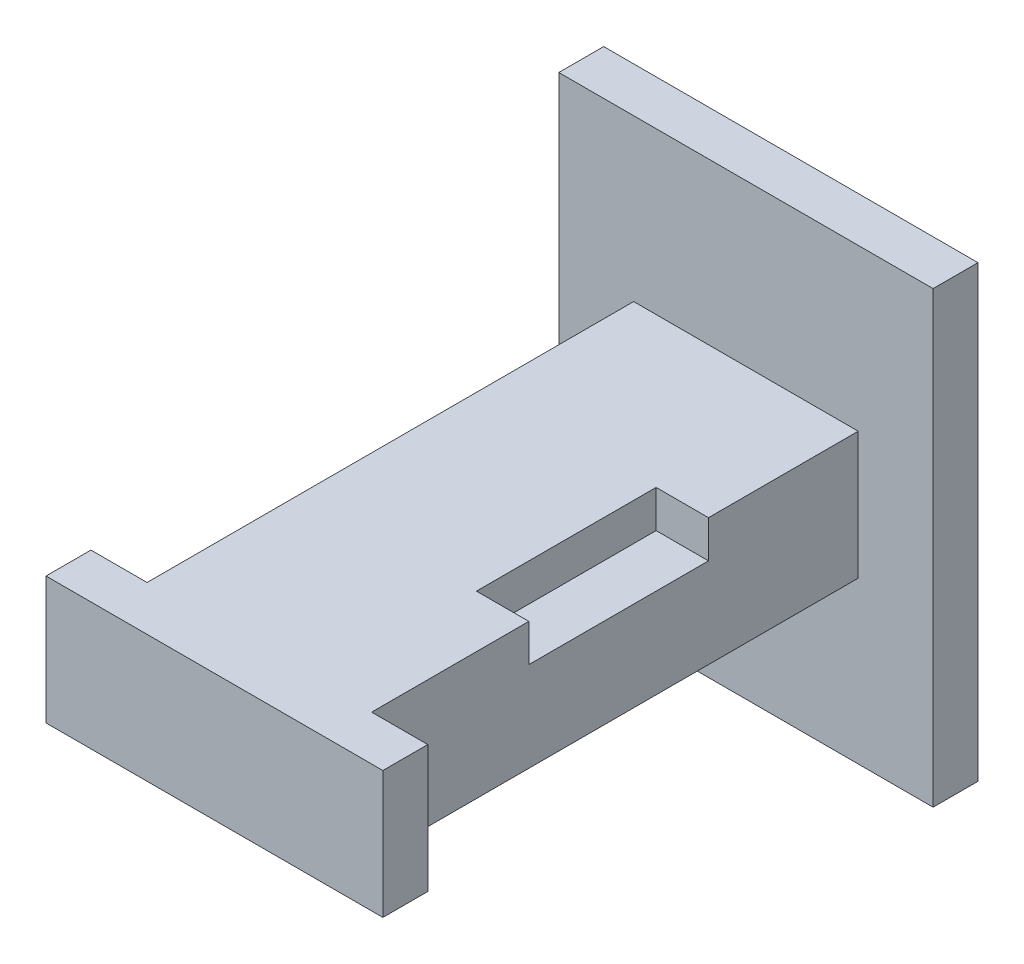
ISO-10303-21;
HEADER;
FILE_DESCRIPTION(('STEP AP214'),'2;1');
FILE_NAME('part.step','',(''),(''),'','','');
FILE_SCHEMA(('AUTOMOTIVE_DESIGN { 1 0 10303 214 1 1 1 1 }'));
ENDSEC;
DATA;
#1=APPLICATION_CONTEXT('core data for automotive mechanical design processes');
#2=APPLICATION_PROTOCOL_DEFINITION('international standard','automotive_design',2000,#1);
#3=PRODUCT_CONTEXT('',#1,'mechanical');
#4=PRODUCT('Part','Part','',(#3));
#5=PRODUCT_RELATED_PRODUCT_CATEGORY('part','',(#4));
#6=PRODUCT_DEFINITION_FORMATION('','',#4);
#7=PRODUCT_DEFINITION_CONTEXT('part definition',#1,'design');
#8=PRODUCT_DEFINITION('design','',#6,#7);
#9=PRODUCT_DEFINITION_SHAPE('','',#8);
#10=(LENGTH_UNIT() NAMED_UNIT(*) SI_UNIT(.MILLI.,.METRE.));
#11=(NAMED_UNIT(*) PLANE_ANGLE_UNIT() SI_UNIT($,.RADIAN.));
#12=(NAMED_UNIT(*) SI_UNIT($,.STERADIAN.) SOLID_ANGLE_UNIT());
#13=UNCERTAINTY_MEASURE_WITH_UNIT(LENGTH_MEASURE(1.E-05),#10,'distance_accuracy_value','');
#14=(GEOMETRIC_REPRESENTATION_CONTEXT(3) GLOBAL_UNCERTAINTY_ASSIGNED_CONTEXT((#13)) GLOBAL_UNIT_ASSIGNED_CONTEXT((#10,
#11,#12)) REPRESENTATION_CONTEXT('',''));
#15=CARTESIAN_POINT('',(0.,0.,0.));
#16=DIRECTION('',(0.,0.,1.));
#17=DIRECTION('',(1.,0.,0.));
#18=AXIS2_PLACEMENT_3D('',#15,#16,#17);
#19=CARTESIAN_POINT('',(0.,0.,71.));
#20=DIRECTION('',(0.,0.,-1.));
#21=DIRECTION('',(-1.,0.,0.));
#22=AXIS2_PLACEMENT_3D('',#19,#20,#21);
#23=PLANE('',#22);
#24=DIRECTION('',(1.,0.,0.));
#25=VECTOR('',#24,1.);
#26=CARTESIAN_POINT('',(-22.5,-8.5,71.));
#27=LINE('',#26,#25);
#28=CARTESIAN_POINT('',(-22.5,-8.5,71.));
#29=VERTEX_POINT('',#28);
#30=CARTESIAN_POINT('',(-15.,-8.5,71.));
#31=VERTEX_POINT('',#30);
#32=EDGE_CURVE('E180',#29,#31,#27,.T.);
#33=ORIENTED_EDGE('',*,*,#32,.F.);
#34=DIRECTION('',(0.,-1.,0.));
#35=VECTOR('',#34,1.);
#36=CARTESIAN_POINT('',(-22.5,-15.,71.));
#37=LINE('',#36,#35);
#38=CARTESIAN_POINT('',(-22.5,8.5,71.));
#39=VERTEX_POINT('',#38);
#40=EDGE_CURVE('E194',#39,#29,#37,.T.);
#41=ORIENTED_EDGE('',*,*,#40,.F.);
#42=DIRECTION('',(-1.,0.,0.));
#43=VECTOR('',#42,1.);
#44=CARTESIAN_POINT('',(22.5,8.5,71.));
#45=LINE('',#44,#43);
#46=CARTESIAN_POINT('',(-15.,8.5,71.));
#47=VERTEX_POINT('',#46);
#48=EDGE_CURVE('E556',#47,#39,#45,.T.);
#49=ORIENTED_EDGE('',*,*,#48,.F.);
#50=DIRECTION('',(0.,-1.,0.));
#51=VECTOR('',#50,1.);
#52=CARTESIAN_POINT('',(-15.,-8.5,71.));
#53=LINE('',#52,#51);
#54=EDGE_CURVE('E207',#47,#31,#53,.T.);
#55=ORIENTED_EDGE('',*,*,#54,.T.);
#56=EDGE_LOOP('',(#33,#41,#49,#55));
#57=FACE_BOUND('',#56,.T.);
#58=ADVANCED_FACE('F34',(#57),#23,.T.);
#59=CARTESIAN_POINT('',(0.,0.,6.));
#60=DIRECTION('',(0.,0.,-1.));
#61=DIRECTION('',(-1.,0.,0.));
#62=AXIS2_PLACEMENT_3D('',#59,#60,#61);
#63=PLANE('',#62);
#64=DIRECTION('',(0.,1.,0.));
#65=VECTOR('',#64,1.);
#66=CARTESIAN_POINT('',(25.,-30.,6.));
#67=LINE('',#66,#65);
#68=CARTESIAN_POINT('',(25.,-30.,6.));
#69=VERTEX_POINT('',#68);
#70=CARTESIAN_POINT('',(25.,30.,6.));
#71=VERTEX_POINT('',#70);
#72=EDGE_CURVE('E234',#69,#71,#67,.T.);
#73=ORIENTED_EDGE('',*,*,#72,.T.);
#74=DIRECTION('',(-1.,0.,0.));
#75=VECTOR('',#74,1.);
#76=CARTESIAN_POINT('',(-25.,30.,6.));
#77=LINE('',#76,#75);
#78=CARTESIAN_POINT('',(-25.,30.,6.));
#79=VERTEX_POINT('',#78);
#80=EDGE_CURVE('E237',#71,#79,#77,.T.);
#81=ORIENTED_EDGE('',*,*,#80,.T.);
#82=DIRECTION('',(0.,-1.,0.));
#83=VECTOR('',#82,1.);
#84=CARTESIAN_POINT('',(-25.,-30.,6.));
#85=LINE('',#84,#83);
#86=CARTESIAN_POINT('',(-25.,-30.,6.));
#87=VERTEX_POINT('',#86);
#88=EDGE_CURVE('E240',#79,#87,#85,.T.);
#89=ORIENTED_EDGE('',*,*,#88,.T.);
#90=DIRECTION('',(1.,0.,0.));
#91=VECTOR('',#90,1.);
#92=CARTESIAN_POINT('',(-25.,-30.,6.));
#93=LINE('',#92,#91);
#94=EDGE_CURVE('E242',#87,#69,#93,.T.);
#95=ORIENTED_EDGE('',*,*,#94,.T.);
#96=EDGE_LOOP('',(#73,#81,#89,#95));
#97=FACE_BOUND('',#96,.T.);
#98=DIRECTION('',(0.,1.,0.));
#99=VECTOR('',#98,1.);
#100=CARTESIAN_POINT('',(15.,-8.5,6.));
#101=LINE('',#100,#99);
#102=CARTESIAN_POINT('',(15.,-8.5,6.));
#103=VERTEX_POINT('',#102);
#104=CARTESIAN_POINT('',(15.,8.5,6.));
#105=VERTEX_POINT('',#104);
#106=EDGE_CURVE('E211',#103,#105,#101,.T.);
#107=ORIENTED_EDGE('',*,*,#106,.F.);
#108=DIRECTION('',(1.,0.,0.));
#109=VECTOR('',#108,1.);
#110=CARTESIAN_POINT('',(-15.,-8.5,6.));
#111=LINE('',#110,#109);
#112=CARTESIAN_POINT('',(-15.,-8.5,6.));
#113=VERTEX_POINT('',#112);
#114=EDGE_CURVE('E208',#113,#103,#111,.T.);
#115=ORIENTED_EDGE('',*,*,#114,.F.);
#116=DIRECTION('',(0.,-1.,0.));
#117=VECTOR('',#116,1.);
#118=CARTESIAN_POINT('',(-15.,-8.5,6.));
#119=LINE('',#118,#117);
#120=CARTESIAN_POINT('',(-15.,8.5,6.));
#121=VERTEX_POINT('',#120);
#122=EDGE_CURVE('E217',#121,#113,#119,.T.);
#123=ORIENTED_EDGE('',*,*,#122,.F.);
#124=DIRECTION('',(-1.,0.,0.));
#125=VECTOR('',#124,1.);
#126=CARTESIAN_POINT('',(-15.,8.5,6.));
#127=LINE('',#126,#125);
#128=EDGE_CURVE('E214',#105,#121,#127,.T.);
#129=ORIENTED_EDGE('',*,*,#128,.F.);
#130=EDGE_LOOP('',(#107,#115,#123,#129));
#131=FACE_BOUND('',#130,.T.);
#132=ADVANCED_FACE('F276',(#97,#131),#63,.F.);
#133=CARTESIAN_POINT('',(25.,-30.,6.));
#134=DIRECTION('',(-1.,0.,0.));
#135=DIRECTION('',(0.,0.,1.));
#136=AXIS2_PLACEMENT_3D('',#133,#134,#135);
#137=PLANE('',#136);
#138=DIRECTION('',(0.,1.,0.));
#139=VECTOR('',#138,1.);
#140=CARTESIAN_POINT('',(25.,-30.,0.));
#141=LINE('',#140,#139);
#142=CARTESIAN_POINT('',(25.,-30.,0.));
#143=VERTEX_POINT('',#142);
#144=CARTESIAN_POINT('',(25.,30.,0.));
#145=VERTEX_POINT('',#144);
#146=EDGE_CURVE('E233',#143,#145,#141,.T.);
#147=ORIENTED_EDGE('',*,*,#146,.T.);
#148=DIRECTION('',(0.,0.,-1.));
#149=VECTOR('',#148,1.);
#150=CARTESIAN_POINT('',(25.,30.,6.));
#151=LINE('',#150,#149);
#152=EDGE_CURVE('E11',#71,#145,#151,.T.);
#153=ORIENTED_EDGE('',*,*,#152,.F.);
#154=ORIENTED_EDGE('',*,*,#72,.F.);
#155=DIRECTION('',(0.,0.,-1.));
#156=VECTOR('',#155,1.);
#157=CARTESIAN_POINT('',(25.,-30.,6.));
#158=LINE('',#157,#156);
#159=EDGE_CURVE('E244',#69,#143,#158,.T.);
#160=ORIENTED_EDGE('',*,*,#159,.T.);
#161=EDGE_LOOP('',(#147,#153,#154,#160));
#162=FACE_BOUND('',#161,.T.);
#163=ADVANCED_FACE('F36',(#162),#137,.F.);
#164=CARTESIAN_POINT('',(-25.,30.,6.));
#165=DIRECTION('',(0.,-1.,0.));
#166=DIRECTION('',(0.,0.,-1.));
#167=AXIS2_PLACEMENT_3D('',#164,#165,#166);
#168=PLANE('',#167);
#169=DIRECTION('',(-1.,0.,0.));
#170=VECTOR('',#169,1.);
#171=CARTESIAN_POINT('',(-25.,30.,0.));
#172=LINE('',#171,#170);
#173=CARTESIAN_POINT('',(-25.,30.,0.));
#174=VERTEX_POINT('',#173);
#175=EDGE_CURVE('E247',#145,#174,#172,.T.);
#176=ORIENTED_EDGE('',*,*,#175,.T.);
#177=DIRECTION('',(0.,0.,-1.));
#178=VECTOR('',#177,1.);
#179=CARTESIAN_POINT('',(-25.,30.,6.));
#180=LINE('',#179,#178);
#181=EDGE_CURVE('E42',#79,#174,#180,.T.);
#182=ORIENTED_EDGE('',*,*,#181,.F.);
#183=ORIENTED_EDGE('',*,*,#80,.F.);
#184=ORIENTED_EDGE('',*,*,#152,.T.);
#185=EDGE_LOOP('',(#176,#182,#183,#184));
#186=FACE_BOUND('',#185,.T.);
#187=ADVANCED_FACE('F278',(#186),#168,.F.);
#188=CARTESIAN_POINT('',(-25.,-30.,6.));
#189=DIRECTION('',(1.,0.,0.));
#190=DIRECTION('',(0.,0.,-1.));
#191=AXIS2_PLACEMENT_3D('',#188,#189,#190);
#192=PLANE('',#191);
#193=DIRECTION('',(0.,-1.,0.));
#194=VECTOR('',#193,1.);
#195=CARTESIAN_POINT('',(-25.,-30.,0.));
#196=LINE('',#195,#194);
#197=CARTESIAN_POINT('',(-25.,-30.,0.));
#198=VERTEX_POINT('',#197);
#199=EDGE_CURVE('E249',#174,#198,#196,.T.);
#200=ORIENTED_EDGE('',*,*,#199,.T.);
#201=DIRECTION('',(0.,0.,-1.));
#202=VECTOR('',#201,1.);
#203=CARTESIAN_POINT('',(-25.,-30.,6.));
#204=LINE('',#203,#202);
#205=EDGE_CURVE('E254',#87,#198,#204,.T.);
#206=ORIENTED_EDGE('',*,*,#205,.F.);
#207=ORIENTED_EDGE('',*,*,#88,.F.);
#208=ORIENTED_EDGE('',*,*,#181,.T.);
#209=EDGE_LOOP('',(#200,#206,#207,#208));
#210=FACE_BOUND('',#209,.T.);
#211=ADVANCED_FACE('F261',(#210),#192,.F.);
#212=CARTESIAN_POINT('',(-25.,-30.,6.));
#213=DIRECTION('',(0.,1.,0.));
#214=DIRECTION('',(0.,0.,1.));
#215=AXIS2_PLACEMENT_3D('',#212,#213,#214);
#216=PLANE('',#215);
#217=DIRECTION('',(1.,0.,0.));
#218=VECTOR('',#217,1.);
#219=CARTESIAN_POINT('',(-25.,-30.,0.));
#220=LINE('',#219,#218);
#221=EDGE_CURVE('E238',#198,#143,#220,.T.);
#222=ORIENTED_EDGE('',*,*,#221,.T.);
#223=ORIENTED_EDGE('',*,*,#159,.F.);
#224=ORIENTED_EDGE('',*,*,#94,.F.);
#225=ORIENTED_EDGE('',*,*,#205,.T.);
#226=EDGE_LOOP('',(#222,#223,#224,#225));
#227=FACE_BOUND('',#226,.T.);
#228=ADVANCED_FACE('F270',(#227),#216,.F.);
#229=CARTESIAN_POINT('',(0.,0.,0.));
#230=DIRECTION('',(0.,0.,-1.));
#231=DIRECTION('',(-1.,0.,0.));
#232=AXIS2_PLACEMENT_3D('',#229,#230,#231);
#233=PLANE('',#232);
#234=ORIENTED_EDGE('',*,*,#146,.F.);
#235=ORIENTED_EDGE('',*,*,#221,.F.);
#236=ORIENTED_EDGE('',*,*,#199,.F.);
#237=ORIENTED_EDGE('',*,*,#175,.F.);
#238=EDGE_LOOP('',(#234,#235,#236,#237));
#239=FACE_BOUND('',#238,.T.);
#240=ADVANCED_FACE('F267',(#239),#233,.T.);
#241=CARTESIAN_POINT('',(15.,-8.5,71.));
#242=DIRECTION('',(-1.,0.,0.));
#243=DIRECTION('',(0.,0.,1.));
#244=AXIS2_PLACEMENT_3D('',#241,#242,#243);
#245=PLANE('',#244);
#246=DIRECTION('',(0.,0.,-1.));
#247=VECTOR('',#246,1.);
#248=CARTESIAN_POINT('',(15.,3.5,50.));
#249=LINE('',#248,#247);
#250=CARTESIAN_POINT('',(15.,3.5,50.));
#251=VERTEX_POINT('',#250);
#252=CARTESIAN_POINT('',(15.,3.5,26.));
#253=VERTEX_POINT('',#252);
#254=EDGE_CURVE('E504',#251,#253,#249,.T.);
#255=ORIENTED_EDGE('',*,*,#254,.F.);
#256=DIRECTION('',(0.,-1.,0.));
#257=VECTOR('',#256,1.);
#258=CARTESIAN_POINT('',(15.,8.5,50.));
#259=LINE('',#258,#257);
#260=CARTESIAN_POINT('',(15.,8.5,50.));
#261=VERTEX_POINT('',#260);
#262=EDGE_CURVE('E512',#261,#251,#259,.T.);
#263=ORIENTED_EDGE('',*,*,#262,.F.);
#264=DIRECTION('',(0.,0.,-1.));
#265=VECTOR('',#264,1.);
#266=CARTESIAN_POINT('',(15.,8.5,71.));
#267=LINE('',#266,#265);
#268=CARTESIAN_POINT('',(15.,8.5,71.));
#269=VERTEX_POINT('',#268);
#270=EDGE_CURVE('E230',#269,#261,#267,.T.);
#271=ORIENTED_EDGE('',*,*,#270,.F.);
#272=DIRECTION('',(0.,1.,0.));
#273=VECTOR('',#272,1.);
#274=CARTESIAN_POINT('',(15.,-8.5,71.));
#275=LINE('',#274,#273);
#276=CARTESIAN_POINT('',(15.,-8.5,71.));
#277=VERTEX_POINT('',#276);
#278=EDGE_CURVE('E205',#277,#269,#275,.T.);
#279=ORIENTED_EDGE('',*,*,#278,.F.);
#280=DIRECTION('',(0.,0.,-1.));
#281=VECTOR('',#280,1.);
#282=CARTESIAN_POINT('',(15.,-8.5,71.));
#283=LINE('',#282,#281);
#284=EDGE_CURVE('E175',#277,#103,#283,.T.);
#285=ORIENTED_EDGE('',*,*,#284,.T.);
#286=ORIENTED_EDGE('',*,*,#106,.T.);
#287=CARTESIAN_POINT('',(15.,8.5,26.));
#288=VERTEX_POINT('',#287);
#289=EDGE_CURVE('E229',#288,#105,#267,.T.);
#290=ORIENTED_EDGE('',*,*,#289,.F.);
#291=DIRECTION('',(0.,1.,0.));
#292=VECTOR('',#291,1.);
#293=CARTESIAN_POINT('',(15.,8.5,26.));
#294=LINE('',#293,#292);
#295=EDGE_CURVE('E500',#253,#288,#294,.T.);
#296=ORIENTED_EDGE('',*,*,#295,.F.);
#297=EDGE_LOOP('',(#255,#263,#271,#279,#285,#286,#290,#296));
#298=FACE_BOUND('',#297,.T.);
#299=ADVANCED_FACE('F313',(#298),#245,.F.);
#300=CARTESIAN_POINT('',(-15.,8.5,71.));
#301=DIRECTION('',(0.,-1.,0.));
#302=DIRECTION('',(0.,0.,-1.));
#303=AXIS2_PLACEMENT_3D('',#300,#301,#302);
#304=PLANE('',#303);
#305=ORIENTED_EDGE('',*,*,#270,.T.);
#306=DIRECTION('',(1.,0.,0.));
#307=VECTOR('',#306,1.);
#308=CARTESIAN_POINT('',(8.,8.5,50.));
#309=LINE('',#308,#307);
#310=CARTESIAN_POINT('',(8.,8.5,50.));
#311=VERTEX_POINT('',#310);
#312=EDGE_CURVE('E518',#311,#261,#309,.T.);
#313=ORIENTED_EDGE('',*,*,#312,.F.);
#314=DIRECTION('',(0.,0.,1.));
#315=VECTOR('',#314,1.);
#316=CARTESIAN_POINT('',(8.,8.5,50.));
#317=LINE('',#316,#315);
#318=CARTESIAN_POINT('',(8.,8.5,26.));
#319=VERTEX_POINT('',#318);
#320=EDGE_CURVE('E498',#319,#311,#317,.T.);
#321=ORIENTED_EDGE('',*,*,#320,.F.);
#322=DIRECTION('',(1.,0.,0.));
#323=VECTOR('',#322,1.);
#324=CARTESIAN_POINT('',(8.,8.5,26.));
#325=LINE('',#324,#323);
#326=EDGE_CURVE('E521',#319,#288,#325,.T.);
#327=ORIENTED_EDGE('',*,*,#326,.T.);
#328=ORIENTED_EDGE('',*,*,#289,.T.);
#329=ORIENTED_EDGE('',*,*,#128,.T.);
#330=DIRECTION('',(0.,0.,-1.));
#331=VECTOR('',#330,1.);
#332=CARTESIAN_POINT('',(-15.,8.5,71.));
#333=LINE('',#332,#331);
#334=EDGE_CURVE('E226',#47,#121,#333,.T.);
#335=ORIENTED_EDGE('',*,*,#334,.F.);
#336=ORIENTED_EDGE('',*,*,#48,.T.);
#337=DIRECTION('',(0.,0.,1.));
#338=VECTOR('',#337,1.);
#339=CARTESIAN_POINT('',(-22.5,8.5,71.));
#340=LINE('',#339,#338);
#341=CARTESIAN_POINT('',(-22.5,8.5,77.));
#342=VERTEX_POINT('',#341);
#343=EDGE_CURVE('E57',#39,#342,#340,.T.);
#344=ORIENTED_EDGE('',*,*,#343,.T.);
#345=DIRECTION('',(1.,0.,0.));
#346=VECTOR('',#345,1.);
#347=CARTESIAN_POINT('',(-22.5,8.5,77.));
#348=LINE('',#347,#346);
#349=CARTESIAN_POINT('',(22.5,8.5,77.));
#350=VERTEX_POINT('',#349);
#351=EDGE_CURVE('E552',#342,#350,#348,.T.);
#352=ORIENTED_EDGE('',*,*,#351,.T.);
#353=DIRECTION('',(0.,0.,-1.));
#354=VECTOR('',#353,1.);
#355=CARTESIAN_POINT('',(22.5,8.5,77.));
#356=LINE('',#355,#354);
#357=CARTESIAN_POINT('',(22.5,8.5,71.));
#358=VERTEX_POINT('',#357);
#359=EDGE_CURVE('E515',#350,#358,#356,.T.);
#360=ORIENTED_EDGE('',*,*,#359,.T.);
#361=EDGE_CURVE('E193',#358,#269,#45,.T.);
#362=ORIENTED_EDGE('',*,*,#361,.T.);
#363=EDGE_LOOP('',(#305,#313,#321,#327,#328,#329,#335,#336,#344,#352,#360,#362));
#364=FACE_BOUND('',#363,.T.);
#365=ADVANCED_FACE('F307',(#364),#304,.F.);
#366=CARTESIAN_POINT('',(-15.,-8.5,71.));
#367=DIRECTION('',(1.,0.,0.));
#368=DIRECTION('',(0.,0.,-1.));
#369=AXIS2_PLACEMENT_3D('',#366,#367,#368);
#370=PLANE('',#369);
#371=DIRECTION('',(0.,0.,-1.));
#372=VECTOR('',#371,1.);
#373=CARTESIAN_POINT('',(-15.,-8.5,71.));
#374=LINE('',#373,#372);
#375=CARTESIAN_POINT('',(-15.,-8.5,33.));
#376=VERTEX_POINT('',#375);
#377=EDGE_CURVE('E222',#376,#113,#374,.T.);
#378=ORIENTED_EDGE('',*,*,#377,.F.);
#379=DIRECTION('',(0.,-1.,0.));
#380=VECTOR('',#379,1.);
#381=CARTESIAN_POINT('',(-15.,-8.5,33.));
#382=LINE('',#381,#380);
#383=CARTESIAN_POINT('',(-15.,4.5,33.));
#384=VERTEX_POINT('',#383);
#385=EDGE_CURVE('E520',#384,#376,#382,.T.);
#386=ORIENTED_EDGE('',*,*,#385,.F.);
#387=DIRECTION('',(0.,0.,-1.));
#388=VECTOR('',#387,1.);
#389=CARTESIAN_POINT('',(-15.,4.5,33.));
#390=LINE('',#389,#388);
#391=CARTESIAN_POINT('',(-15.,4.5,51.));
#392=VERTEX_POINT('',#391);
#393=EDGE_CURVE('E530',#392,#384,#390,.T.);
#394=ORIENTED_EDGE('',*,*,#393,.F.);
#395=DIRECTION('',(0.,1.,0.));
#396=VECTOR('',#395,1.);
#397=CARTESIAN_POINT('',(-15.,-8.5,51.));
#398=LINE('',#397,#396);
#399=CARTESIAN_POINT('',(-15.,-8.5,51.));
#400=VERTEX_POINT('',#399);
#401=EDGE_CURVE('E541',#400,#392,#398,.T.);
#402=ORIENTED_EDGE('',*,*,#401,.F.);
#403=EDGE_CURVE('E223',#31,#400,#374,.T.);
#404=ORIENTED_EDGE('',*,*,#403,.F.);
#405=ORIENTED_EDGE('',*,*,#54,.F.);
#406=ORIENTED_EDGE('',*,*,#334,.T.);
#407=ORIENTED_EDGE('',*,*,#122,.T.);
#408=EDGE_LOOP('',(#378,#386,#394,#402,#404,#405,#406,#407));
#409=FACE_BOUND('',#408,.T.);
#410=ADVANCED_FACE('F302',(#409),#370,.F.);
#411=CARTESIAN_POINT('',(-15.,-8.5,71.));
#412=DIRECTION('',(0.,1.,0.));
#413=DIRECTION('',(0.,0.,1.));
#414=AXIS2_PLACEMENT_3D('',#411,#412,#413);
#415=PLANE('',#414);
#416=DIRECTION('',(0.,0.,1.));
#417=VECTOR('',#416,1.);
#418=CARTESIAN_POINT('',(-5.,-8.5,33.));
#419=LINE('',#418,#417);
#420=CARTESIAN_POINT('',(-5.,-8.5,33.));
#421=VERTEX_POINT('',#420);
#422=CARTESIAN_POINT('',(-5.,-8.5,51.));
#423=VERTEX_POINT('',#422);
#424=EDGE_CURVE('E529',#421,#423,#419,.T.);
#425=ORIENTED_EDGE('',*,*,#424,.F.);
#426=DIRECTION('',(-1.,0.,0.));
#427=VECTOR('',#426,1.);
#428=CARTESIAN_POINT('',(-5.,-8.5,33.));
#429=LINE('',#428,#427);
#430=EDGE_CURVE('E539',#421,#376,#429,.T.);
#431=ORIENTED_EDGE('',*,*,#430,.T.);
#432=ORIENTED_EDGE('',*,*,#377,.T.);
#433=ORIENTED_EDGE('',*,*,#114,.T.);
#434=ORIENTED_EDGE('',*,*,#284,.F.);
#435=CARTESIAN_POINT('',(22.5,-8.5,71.));
#436=VERTEX_POINT('',#435);
#437=EDGE_CURVE('E170',#277,#436,#27,.T.);
#438=ORIENTED_EDGE('',*,*,#437,.T.);
#439=DIRECTION('',(0.,0.,1.));
#440=VECTOR('',#439,1.);
#441=CARTESIAN_POINT('',(22.5,-8.5,71.));
#442=LINE('',#441,#440);
#443=CARTESIAN_POINT('',(22.5,-8.5,77.));
#444=VERTEX_POINT('',#443);
#445=EDGE_CURVE('E49',#436,#444,#442,.T.);
#446=ORIENTED_EDGE('',*,*,#445,.T.);
#447=DIRECTION('',(-1.,0.,0.));
#448=VECTOR('',#447,1.);
#449=CARTESIAN_POINT('',(22.5,-8.5,77.));
#450=LINE('',#449,#448);
#451=CARTESIAN_POINT('',(-22.5,-8.5,77.));
#452=VERTEX_POINT('',#451);
#453=EDGE_CURVE('E189',#444,#452,#450,.T.);
#454=ORIENTED_EDGE('',*,*,#453,.T.);
#455=DIRECTION('',(0.,0.,-1.));
#456=VECTOR('',#455,1.);
#457=CARTESIAN_POINT('',(-22.5,-8.5,77.));
#458=LINE('',#457,#456);
#459=EDGE_CURVE('E555',#452,#29,#458,.T.);
#460=ORIENTED_EDGE('',*,*,#459,.T.);
#461=ORIENTED_EDGE('',*,*,#32,.T.);
#462=ORIENTED_EDGE('',*,*,#403,.T.);
#463=DIRECTION('',(-1.,0.,0.));
#464=VECTOR('',#463,1.);
#465=CARTESIAN_POINT('',(-5.,-8.5,51.));
#466=LINE('',#465,#464);
#467=EDGE_CURVE('E547',#423,#400,#466,.T.);
#468=ORIENTED_EDGE('',*,*,#467,.F.);
#469=EDGE_LOOP('',(#425,#431,#432,#433,#434,#438,#446,#454,#460,#461,#462,#468));
#470=FACE_BOUND('',#469,.T.);
#471=ADVANCED_FACE('F172',(#470),#415,.F.);
#472=ORIENTED_EDGE('',*,*,#437,.F.);
#473=ORIENTED_EDGE('',*,*,#278,.T.);
#474=ORIENTED_EDGE('',*,*,#361,.F.);
#475=DIRECTION('',(0.,1.,0.));
#476=VECTOR('',#475,1.);
#477=CARTESIAN_POINT('',(22.5,-15.,71.));
#478=LINE('',#477,#476);
#479=EDGE_CURVE('E186',#436,#358,#478,.T.);
#480=ORIENTED_EDGE('',*,*,#479,.F.);
#481=EDGE_LOOP('',(#472,#473,#474,#480));
#482=FACE_BOUND('',#481,.T.);
#483=ADVANCED_FACE('F192',(#482),#23,.T.);
#484=CARTESIAN_POINT('',(22.5,-15.,77.));
#485=DIRECTION('',(-1.,0.,0.));
#486=DIRECTION('',(0.,0.,1.));
#487=AXIS2_PLACEMENT_3D('',#484,#485,#486);
#488=PLANE('',#487);
#489=DIRECTION('',(0.,1.,0.));
#490=VECTOR('',#489,1.);
#491=CARTESIAN_POINT('',(22.5,-15.,77.));
#492=LINE('',#491,#490);
#493=EDGE_CURVE('E188',#444,#350,#492,.T.);
#494=ORIENTED_EDGE('',*,*,#493,.F.);
#495=ORIENTED_EDGE('',*,*,#445,.F.);
#496=ORIENTED_EDGE('',*,*,#479,.T.);
#497=ORIENTED_EDGE('',*,*,#359,.F.);
#498=EDGE_LOOP('',(#494,#495,#496,#497));
#499=FACE_BOUND('',#498,.T.);
#500=ADVANCED_FACE('F184',(#499),#488,.F.);
#501=CARTESIAN_POINT('',(-22.5,-15.,77.));
#502=DIRECTION('',(1.,0.,0.));
#503=DIRECTION('',(0.,0.,-1.));
#504=AXIS2_PLACEMENT_3D('',#501,#502,#503);
#505=PLANE('',#504);
#506=ORIENTED_EDGE('',*,*,#40,.T.);
#507=ORIENTED_EDGE('',*,*,#459,.F.);
#508=DIRECTION('',(0.,-1.,0.));
#509=VECTOR('',#508,1.);
#510=CARTESIAN_POINT('',(-22.5,-15.,77.));
#511=LINE('',#510,#509);
#512=EDGE_CURVE('E202',#342,#452,#511,.T.);
#513=ORIENTED_EDGE('',*,*,#512,.F.);
#514=ORIENTED_EDGE('',*,*,#343,.F.);
#515=EDGE_LOOP('',(#506,#507,#513,#514));
#516=FACE_BOUND('',#515,.T.);
#517=ADVANCED_FACE('F300',(#516),#505,.F.);
#518=CARTESIAN_POINT('',(0.,0.,77.));
#519=DIRECTION('',(0.,0.,-1.));
#520=DIRECTION('',(-1.,0.,0.));
#521=AXIS2_PLACEMENT_3D('',#518,#519,#520);
#522=PLANE('',#521);
#523=ORIENTED_EDGE('',*,*,#512,.T.);
#524=ORIENTED_EDGE('',*,*,#453,.F.);
#525=ORIENTED_EDGE('',*,*,#493,.T.);
#526=ORIENTED_EDGE('',*,*,#351,.F.);
#527=EDGE_LOOP('',(#523,#524,#525,#526));
#528=FACE_BOUND('',#527,.T.);
#529=ADVANCED_FACE('F368',(#528),#522,.F.);
#530=CARTESIAN_POINT('',(-5.,-8.5,33.));
#531=DIRECTION('',(0.,0.,-1.));
#532=DIRECTION('',(-1.,0.,0.));
#533=AXIS2_PLACEMENT_3D('',#530,#531,#532);
#534=PLANE('',#533);
#535=ORIENTED_EDGE('',*,*,#385,.T.);
#536=ORIENTED_EDGE('',*,*,#430,.F.);
#537=DIRECTION('',(0.,-1.,0.));
#538=VECTOR('',#537,1.);
#539=CARTESIAN_POINT('',(-5.,-8.5,33.));
#540=LINE('',#539,#538);
#541=CARTESIAN_POINT('',(-5.,4.5,33.));
#542=VERTEX_POINT('',#541);
#543=EDGE_CURVE('E527',#542,#421,#540,.T.);
#544=ORIENTED_EDGE('',*,*,#543,.F.);
#545=DIRECTION('',(-1.,0.,0.));
#546=VECTOR('',#545,1.);
#547=CARTESIAN_POINT('',(-5.,4.5,33.));
#548=LINE('',#547,#546);
#549=EDGE_CURVE('E195',#542,#384,#548,.T.);
#550=ORIENTED_EDGE('',*,*,#549,.T.);
#551=EDGE_LOOP('',(#535,#536,#544,#550));
#552=FACE_BOUND('',#551,.T.);
#553=ADVANCED_FACE('F376',(#552),#534,.F.);
#554=CARTESIAN_POINT('',(-5.,4.5,33.));
#555=DIRECTION('',(0.,1.,0.));
#556=DIRECTION('',(0.,0.,1.));
#557=AXIS2_PLACEMENT_3D('',#554,#555,#556);
#558=PLANE('',#557);
#559=ORIENTED_EDGE('',*,*,#393,.T.);
#560=ORIENTED_EDGE('',*,*,#549,.F.);
#561=DIRECTION('',(0.,0.,-1.));
#562=VECTOR('',#561,1.);
#563=CARTESIAN_POINT('',(-5.,4.5,33.));
#564=LINE('',#563,#562);
#565=CARTESIAN_POINT('',(-5.,4.5,51.));
#566=VERTEX_POINT('',#565);
#567=EDGE_CURVE('E536',#566,#542,#564,.T.);
#568=ORIENTED_EDGE('',*,*,#567,.F.);
#569=DIRECTION('',(-1.,0.,0.));
#570=VECTOR('',#569,1.);
#571=CARTESIAN_POINT('',(-5.,4.5,51.));
#572=LINE('',#571,#570);
#573=EDGE_CURVE('E199',#566,#392,#572,.T.);
#574=ORIENTED_EDGE('',*,*,#573,.T.);
#575=EDGE_LOOP('',(#559,#560,#568,#574));
#576=FACE_BOUND('',#575,.T.);
#577=ADVANCED_FACE('F386',(#576),#558,.F.);
#578=CARTESIAN_POINT('',(-5.,-8.5,51.));
#579=DIRECTION('',(0.,0.,1.));
#580=DIRECTION('',(1.,0.,0.));
#581=AXIS2_PLACEMENT_3D('',#578,#579,#580);
#582=PLANE('',#581);
#583=ORIENTED_EDGE('',*,*,#401,.T.);
#584=ORIENTED_EDGE('',*,*,#573,.F.);
#585=DIRECTION('',(0.,1.,0.));
#586=VECTOR('',#585,1.);
#587=CARTESIAN_POINT('',(-5.,-8.5,51.));
#588=LINE('',#587,#586);
#589=EDGE_CURVE('E533',#423,#566,#588,.T.);
#590=ORIENTED_EDGE('',*,*,#589,.F.);
#591=ORIENTED_EDGE('',*,*,#467,.T.);
#592=EDGE_LOOP('',(#583,#584,#590,#591));
#593=FACE_BOUND('',#592,.T.);
#594=ADVANCED_FACE('F393',(#593),#582,.F.);
#595=CARTESIAN_POINT('',(-5.,0.,0.));
#596=DIRECTION('',(1.,0.,0.));
#597=DIRECTION('',(0.,0.,-1.));
#598=AXIS2_PLACEMENT_3D('',#595,#596,#597);
#599=PLANE('',#598);
#600=ORIENTED_EDGE('',*,*,#543,.T.);
#601=ORIENTED_EDGE('',*,*,#424,.T.);
#602=ORIENTED_EDGE('',*,*,#589,.T.);
#603=ORIENTED_EDGE('',*,*,#567,.T.);
#604=EDGE_LOOP('',(#600,#601,#602,#603));
#605=FACE_BOUND('',#604,.T.);
#606=ADVANCED_FACE('F401',(#605),#599,.F.);
#607=CARTESIAN_POINT('',(8.,8.5,50.));
#608=DIRECTION('',(0.,0.,1.));
#609=DIRECTION('',(1.,0.,0.));
#610=AXIS2_PLACEMENT_3D('',#607,#608,#609);
#611=PLANE('',#610);
#612=ORIENTED_EDGE('',*,*,#262,.T.);
#613=DIRECTION('',(1.,0.,0.));
#614=VECTOR('',#613,1.);
#615=CARTESIAN_POINT('',(8.,3.5,50.));
#616=LINE('',#615,#614);
#617=CARTESIAN_POINT('',(8.,3.5,50.));
#618=VERTEX_POINT('',#617);
#619=EDGE_CURVE('E511',#618,#251,#616,.T.);
#620=ORIENTED_EDGE('',*,*,#619,.F.);
#621=DIRECTION('',(0.,-1.,0.));
#622=VECTOR('',#621,1.);
#623=CARTESIAN_POINT('',(8.,8.5,50.));
#624=LINE('',#623,#622);
#625=EDGE_CURVE('E494',#311,#618,#624,.T.);
#626=ORIENTED_EDGE('',*,*,#625,.F.);
#627=ORIENTED_EDGE('',*,*,#312,.T.);
#628=EDGE_LOOP('',(#612,#620,#626,#627));
#629=FACE_BOUND('',#628,.T.);
#630=ADVANCED_FACE('F409',(#629),#611,.F.);
#631=CARTESIAN_POINT('',(8.,8.5,26.));
#632=DIRECTION('',(0.,0.,-1.));
#633=DIRECTION('',(-1.,0.,0.));
#634=AXIS2_PLACEMENT_3D('',#631,#632,#633);
#635=PLANE('',#634);
#636=ORIENTED_EDGE('',*,*,#295,.T.);
#637=ORIENTED_EDGE('',*,*,#326,.F.);
#638=DIRECTION('',(0.,1.,0.));
#639=VECTOR('',#638,1.);
#640=CARTESIAN_POINT('',(8.,8.5,26.));
#641=LINE('',#640,#639);
#642=CARTESIAN_POINT('',(8.,3.5,26.));
#643=VERTEX_POINT('',#642);
#644=EDGE_CURVE('E502',#643,#319,#641,.T.);
#645=ORIENTED_EDGE('',*,*,#644,.F.);
#646=DIRECTION('',(1.,0.,0.));
#647=VECTOR('',#646,1.);
#648=CARTESIAN_POINT('',(8.,3.5,26.));
#649=LINE('',#648,#647);
#650=EDGE_CURVE('E524',#643,#253,#649,.T.);
#651=ORIENTED_EDGE('',*,*,#650,.T.);
#652=EDGE_LOOP('',(#636,#637,#645,#651));
#653=FACE_BOUND('',#652,.T.);
#654=ADVANCED_FACE('F417',(#653),#635,.F.);
#655=CARTESIAN_POINT('',(8.,3.5,50.));
#656=DIRECTION('',(0.,-1.,0.));
#657=DIRECTION('',(0.,0.,-1.));
#658=AXIS2_PLACEMENT_3D('',#655,#656,#657);
#659=PLANE('',#658);
#660=ORIENTED_EDGE('',*,*,#254,.T.);
#661=ORIENTED_EDGE('',*,*,#650,.F.);
#662=DIRECTION('',(0.,0.,-1.));
#663=VECTOR('',#662,1.);
#664=CARTESIAN_POINT('',(8.,3.5,50.));
#665=LINE('',#664,#663);
#666=EDGE_CURVE('E496',#618,#643,#665,.T.);
#667=ORIENTED_EDGE('',*,*,#666,.F.);
#668=ORIENTED_EDGE('',*,*,#619,.T.);
#669=EDGE_LOOP('',(#660,#661,#667,#668));
#670=FACE_BOUND('',#669,.T.);
#671=ADVANCED_FACE('F425',(#670),#659,.F.);
#672=CARTESIAN_POINT('',(8.,0.,0.));
#673=DIRECTION('',(1.,0.,0.));
#674=DIRECTION('',(0.,0.,-1.));
#675=AXIS2_PLACEMENT_3D('',#672,#673,#674);
#676=PLANE('',#675);
#677=ORIENTED_EDGE('',*,*,#625,.T.);
#678=ORIENTED_EDGE('',*,*,#666,.T.);
#679=ORIENTED_EDGE('',*,*,#644,.T.);
#680=ORIENTED_EDGE('',*,*,#320,.T.);
#681=EDGE_LOOP('',(#677,#678,#679,#680));
#682=FACE_BOUND('',#681,.T.);
#683=ADVANCED_FACE('F433',(#682),#676,.T.);
#684=CLOSED_SHELL('',(#58,#132,#163,#187,#211,#228,#240,#299,#365,#410,#471,#483,#500,#517,#529,
#553,#577,#594,#606,#630,#654,#671,#683));
#685=MANIFOLD_SOLID_BREP('B2',#684);
#686=ADVANCED_BREP_SHAPE_REPRESENTATION('',(#18,#685),#14);
#687=SHAPE_DEFINITION_REPRESENTATION(#9,#686);
ENDSEC;
END-ISO-10303-21;
